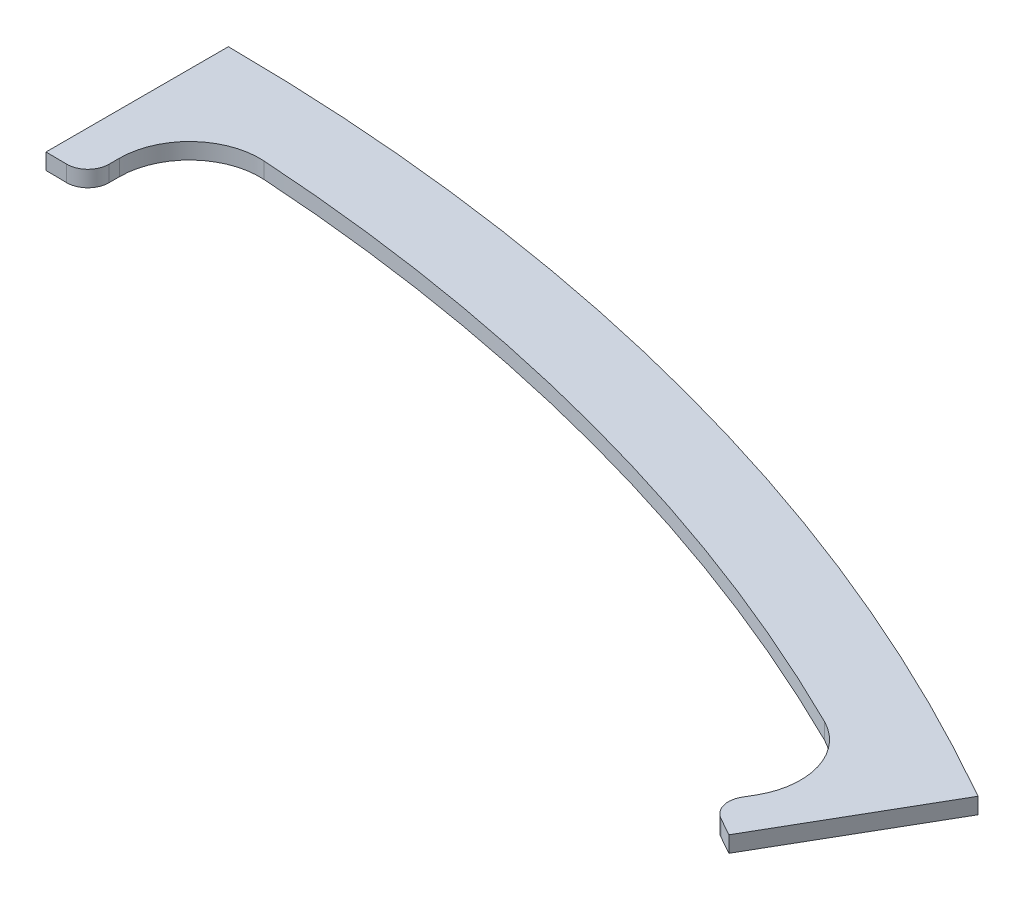
ISO-10303-21;
HEADER;
FILE_DESCRIPTION(('STEP AP214'),'2;1');
FILE_NAME('part.step','',(''),(''),'','','');
FILE_SCHEMA(('AUTOMOTIVE_DESIGN { 1 0 10303 214 1 1 1 1 }'));
ENDSEC;
DATA;
#1=APPLICATION_CONTEXT('core data for automotive mechanical design processes');
#2=APPLICATION_PROTOCOL_DEFINITION('international standard','automotive_design',2000,#1);
#3=PRODUCT_CONTEXT('',#1,'mechanical');
#4=PRODUCT('Part','Part','',(#3));
#5=PRODUCT_RELATED_PRODUCT_CATEGORY('part','',(#4));
#6=PRODUCT_DEFINITION_FORMATION('','',#4);
#7=PRODUCT_DEFINITION_CONTEXT('part definition',#1,'design');
#8=PRODUCT_DEFINITION('design','',#6,#7);
#9=PRODUCT_DEFINITION_SHAPE('','',#8);
#10=(LENGTH_UNIT() NAMED_UNIT(*) SI_UNIT(.MILLI.,.METRE.));
#11=(NAMED_UNIT(*) PLANE_ANGLE_UNIT() SI_UNIT($,.RADIAN.));
#12=(NAMED_UNIT(*) SI_UNIT($,.STERADIAN.) SOLID_ANGLE_UNIT());
#13=UNCERTAINTY_MEASURE_WITH_UNIT(LENGTH_MEASURE(1.E-05),#10,'distance_accuracy_value','');
#14=(GEOMETRIC_REPRESENTATION_CONTEXT(3) GLOBAL_UNCERTAINTY_ASSIGNED_CONTEXT((#13)) GLOBAL_UNIT_ASSIGNED_CONTEXT((#10,
#11,#12)) REPRESENTATION_CONTEXT('',''));
#15=CARTESIAN_POINT('',(0.,0.,0.));
#16=DIRECTION('',(0.,0.,1.));
#17=DIRECTION('',(1.,0.,0.));
#18=AXIS2_PLACEMENT_3D('',#15,#16,#17);
#19=CARTESIAN_POINT('',(0.,2.29,0.));
#20=DIRECTION('',(0.,-1.,0.));
#21=DIRECTION('',(0.,0.,-1.));
#22=AXIS2_PLACEMENT_3D('',#19,#20,#21);
#23=CYLINDRICAL_SURFACE('',#22,271.500362135864);
#24=CARTESIAN_POINT('',(0.,0.,0.));
#25=DIRECTION('',(0.,-1.,0.));
#26=DIRECTION('',(0.,0.,-1.));
#27=AXIS2_PLACEMENT_3D('',#24,#25,#26);
#28=CIRCLE('',#27,271.500362135864);
#29=CARTESIAN_POINT('',(1.50000000000001,0.,-271.496218463361));
#30=VERTEX_POINT('',#29);
#31=CARTESIAN_POINT('',(4.45081973701253,0.,-271.463877603584));
#32=VERTEX_POINT('',#31);
#33=EDGE_CURVE('E230',#30,#32,#28,.T.);
#34=ORIENTED_EDGE('',*,*,#33,.T.);
#35=DIRECTION('',(0.,-1.,0.));
#36=VECTOR('',#35,1.);
#37=CARTESIAN_POINT('',(4.45081973701253,2.29,-271.463877603584));
#38=LINE('',#37,#36);
#39=CARTESIAN_POINT('',(4.45081973701253,2.29,-271.463877603584));
#40=VERTEX_POINT('',#39);
#41=EDGE_CURVE('E52',#32,#40,#38,.F.);
#42=ORIENTED_EDGE('',*,*,#41,.T.);
#43=CARTESIAN_POINT('',(0.,2.29,0.));
#44=DIRECTION('',(0.,-1.,0.));
#45=DIRECTION('',(0.,0.,-1.));
#46=AXIS2_PLACEMENT_3D('',#43,#44,#45);
#47=CIRCLE('',#46,271.500362135864);
#48=CARTESIAN_POINT('',(1.50000000000001,2.29,-271.496218463361));
#49=VERTEX_POINT('',#48);
#50=EDGE_CURVE('E229',#49,#40,#47,.T.);
#51=ORIENTED_EDGE('',*,*,#50,.F.);
#52=DIRECTION('',(0.,-1.,0.));
#53=VECTOR('',#52,1.);
#54=CARTESIAN_POINT('',(1.50000000000001,2.29,-271.496218463361));
#55=LINE('',#54,#53);
#56=EDGE_CURVE('E140',#49,#30,#55,.T.);
#57=ORIENTED_EDGE('',*,*,#56,.T.);
#58=EDGE_LOOP('',(#34,#42,#51,#57));
#59=FACE_BOUND('',#58,.T.);
#60=ADVANCED_FACE('F43',(#59),#23,.F.);
#61=CARTESIAN_POINT('',(0.,2.29,0.));
#62=DIRECTION('',(0.,-1.,0.));
#63=DIRECTION('',(0.,0.,-1.));
#64=AXIS2_PLACEMENT_3D('',#61,#62,#63);
#65=CYLINDRICAL_SURFACE('',#64,297.5);
#66=CARTESIAN_POINT('',(0.,0.,0.));
#67=DIRECTION('',(0.,1.,0.));
#68=DIRECTION('',(0.,0.,-1.));
#69=AXIS2_PLACEMENT_3D('',#66,#67,#68);
#70=CIRCLE('',#69,297.5);
#71=CARTESIAN_POINT('',(147.449071126004,0.,-258.389282719076));
#72=VERTEX_POINT('',#71);
#73=CARTESIAN_POINT('',(1.50000000000001,0.,-297.496218463361));
#74=VERTEX_POINT('',#73);
#75=EDGE_CURVE('E161',#72,#74,#70,.T.);
#76=ORIENTED_EDGE('',*,*,#75,.T.);
#77=DIRECTION('',(0.,-1.,0.));
#78=VECTOR('',#77,1.);
#79=CARTESIAN_POINT('',(1.50000000000001,2.29,-297.496218463361));
#80=LINE('',#79,#78);
#81=CARTESIAN_POINT('',(1.50000000000001,2.29,-297.496218463361));
#82=VERTEX_POINT('',#81);
#83=EDGE_CURVE('E137',#82,#74,#80,.T.);
#84=ORIENTED_EDGE('',*,*,#83,.F.);
#85=CARTESIAN_POINT('',(0.,2.29,0.));
#86=DIRECTION('',(0.,1.,0.));
#87=DIRECTION('',(0.,0.,-1.));
#88=AXIS2_PLACEMENT_3D('',#85,#86,#87);
#89=CIRCLE('',#88,297.5);
#90=CARTESIAN_POINT('',(147.449071126004,2.29,-258.389282719076));
#91=VERTEX_POINT('',#90);
#92=EDGE_CURVE('E146',#91,#82,#89,.T.);
#93=ORIENTED_EDGE('',*,*,#92,.F.);
#94=DIRECTION('',(0.,-1.,0.));
#95=VECTOR('',#94,1.);
#96=CARTESIAN_POINT('',(147.449071126004,2.29,-258.389282719076));
#97=LINE('',#96,#95);
#98=EDGE_CURVE('E237',#91,#72,#97,.T.);
#99=ORIENTED_EDGE('',*,*,#98,.T.);
#100=EDGE_LOOP('',(#76,#84,#93,#99));
#101=FACE_BOUND('',#100,.T.);
#102=ADVANCED_FACE('F159',(#101),#65,.T.);
#103=CARTESIAN_POINT('',(1.50000000000001,2.29,-297.496218463361));
#104=DIRECTION('',(1.,0.,0.));
#105=DIRECTION('',(0.,0.,-1.));
#106=AXIS2_PLACEMENT_3D('',#103,#104,#105);
#107=PLANE('',#106);
#108=DIRECTION('',(0.,0.,1.));
#109=VECTOR('',#108,1.);
#110=CARTESIAN_POINT('',(1.50000000000001,0.,-297.496218463361));
#111=LINE('',#110,#109);
#112=EDGE_CURVE('E242',#74,#30,#111,.T.);
#113=ORIENTED_EDGE('',*,*,#112,.T.);
#114=ORIENTED_EDGE('',*,*,#56,.F.);
#115=DIRECTION('',(0.,0.,1.));
#116=VECTOR('',#115,1.);
#117=CARTESIAN_POINT('',(1.50000000000001,2.29,-297.496218463361));
#118=LINE('',#117,#116);
#119=EDGE_CURVE('E133',#82,#49,#118,.T.);
#120=ORIENTED_EDGE('',*,*,#119,.F.);
#121=ORIENTED_EDGE('',*,*,#83,.T.);
#122=EDGE_LOOP('',(#113,#114,#120,#121));
#123=FACE_BOUND('',#122,.T.);
#124=ADVANCED_FACE('F135',(#123),#107,.F.);
#125=CARTESIAN_POINT('',(131.877415841874,2.29,-237.32002408304));
#126=VERTEX_POINT('',#125);
#127=CARTESIAN_POINT('',(134.449071126004,2.29,-235.87262222068));
#128=VERTEX_POINT('',#127);
#129=EDGE_CURVE('E145',#126,#128,#47,.T.);
#130=ORIENTED_EDGE('',*,*,#129,.F.);
#131=DIRECTION('',(0.,-1.,0.));
#132=VECTOR('',#131,1.);
#133=CARTESIAN_POINT('',(131.877415841874,2.29,-237.32002408304));
#134=LINE('',#133,#132);
#135=CARTESIAN_POINT('',(131.877415841874,0.,-237.32002408304));
#136=VERTEX_POINT('',#135);
#137=EDGE_CURVE('E218',#126,#136,#134,.T.);
#138=ORIENTED_EDGE('',*,*,#137,.T.);
#139=CARTESIAN_POINT('',(134.449071126004,0.,-235.87262222068));
#140=VERTEX_POINT('',#139);
#141=EDGE_CURVE('E246',#136,#140,#28,.T.);
#142=ORIENTED_EDGE('',*,*,#141,.T.);
#143=DIRECTION('',(0.,-1.,0.));
#144=VECTOR('',#143,1.);
#145=CARTESIAN_POINT('',(134.449071126004,2.29,-235.87262222068));
#146=LINE('',#145,#144);
#147=EDGE_CURVE('E170',#128,#140,#146,.T.);
#148=ORIENTED_EDGE('',*,*,#147,.F.);
#149=EDGE_LOOP('',(#130,#138,#142,#148));
#150=FACE_BOUND('',#149,.T.);
#151=ADVANCED_FACE('F291',(#150),#23,.F.);
#152=CARTESIAN_POINT('',(147.449071126004,2.29,-258.389282719076));
#153=DIRECTION('',(-0.866025403784438,0.,-0.500000000000001));
#154=DIRECTION('',(-0.500000000000001,0.,0.866025403784438));
#155=AXIS2_PLACEMENT_3D('',#152,#153,#154);
#156=PLANE('',#155);
#157=DIRECTION('',(0.500000000000001,0.,-0.866025403784438));
#158=VECTOR('',#157,1.);
#159=CARTESIAN_POINT('',(147.449071126004,0.,-258.389282719076));
#160=LINE('',#159,#158);
#161=EDGE_CURVE('E157',#140,#72,#160,.T.);
#162=ORIENTED_EDGE('',*,*,#161,.T.);
#163=ORIENTED_EDGE('',*,*,#98,.F.);
#164=DIRECTION('',(0.500000000000001,0.,-0.866025403784438));
#165=VECTOR('',#164,1.);
#166=CARTESIAN_POINT('',(147.449071126004,2.29,-258.389282719076));
#167=LINE('',#166,#165);
#168=EDGE_CURVE('E152',#128,#91,#167,.T.);
#169=ORIENTED_EDGE('',*,*,#168,.F.);
#170=ORIENTED_EDGE('',*,*,#147,.T.);
#171=EDGE_LOOP('',(#162,#163,#169,#170));
#172=FACE_BOUND('',#171,.T.);
#173=ADVANCED_FACE('F257',(#172),#156,.F.);
#174=CARTESIAN_POINT('',(0.,2.29,0.));
#175=DIRECTION('',(0.,-1.,0.));
#176=DIRECTION('',(0.,0.,-1.));
#177=AXIS2_PLACEMENT_3D('',#174,#175,#176);
#178=PLANE('',#177);
#179=DIRECTION('',(0.5,0.,-0.866025403784438));
#180=VECTOR('',#179,1.);
#181=CARTESIAN_POINT('',(129.203185143459,2.29,-238.786481168198));
#182=LINE('',#181,#180);
#183=CARTESIAN_POINT('',(130.736546701677,2.29,-241.442341293404));
#184=VERTEX_POINT('',#183);
#185=CARTESIAN_POINT('',(131.477814314289,2.29,-242.726254460454));
#186=VERTEX_POINT('',#185);
#187=EDGE_CURVE('E271',#184,#186,#182,.T.);
#188=ORIENTED_EDGE('',*,*,#187,.F.);
#189=CARTESIAN_POINT('',(133.33462291303,2.29,-239.942341293404));
#190=DIRECTION('',(0.,-1.,0.));
#191=DIRECTION('',(0.,0.,-1.));
#192=AXIS2_PLACEMENT_3D('',#189,#190,#191);
#193=CIRCLE('',#192,3.);
#194=EDGE_CURVE('E215',#184,#126,#193,.F.);
#195=ORIENTED_EDGE('',*,*,#194,.T.);
#196=ORIENTED_EDGE('',*,*,#129,.T.);
#197=ORIENTED_EDGE('',*,*,#168,.T.);
#198=ORIENTED_EDGE('',*,*,#92,.T.);
#199=ORIENTED_EDGE('',*,*,#119,.T.);
#200=ORIENTED_EDGE('',*,*,#50,.T.);
#201=CARTESIAN_POINT('',(4.50000000000001,2.29,-274.463474460119));
#202=DIRECTION('',(0.,-1.,0.));
#203=DIRECTION('',(0.,0.,-1.));
#204=AXIS2_PLACEMENT_3D('',#201,#202,#203);
#205=CIRCLE('',#204,3.);
#206=CARTESIAN_POINT('',(7.50000000000001,2.29,-274.463474460119));
#207=VERTEX_POINT('',#206);
#208=EDGE_CURVE('E212',#40,#207,#205,.F.);
#209=ORIENTED_EDGE('',*,*,#208,.T.);
#210=DIRECTION('',(0.,0.,1.));
#211=VECTOR('',#210,1.);
#212=CARTESIAN_POINT('',(7.50000000000001,2.29,-286.402177896714));
#213=LINE('',#212,#211);
#214=CARTESIAN_POINT('',(7.50000000000001,2.29,-275.946009685344));
#215=VERTEX_POINT('',#214);
#216=EDGE_CURVE('E275',#215,#207,#213,.T.);
#217=ORIENTED_EDGE('',*,*,#216,.F.);
#218=CARTESIAN_POINT('',(17.5,2.29,-275.946009685344));
#219=DIRECTION('',(0.,-1.,0.));
#220=DIRECTION('',(0.,0.,-1.));
#221=AXIS2_PLACEMENT_3D('',#218,#219,#220);
#222=CIRCLE('',#221,10.);
#223=CARTESIAN_POINT('',(18.1329105634734,2.29,-285.925960798383));
#224=VERTEX_POINT('',#223);
#225=EDGE_CURVE('E194',#215,#224,#222,.T.);
#226=ORIENTED_EDGE('',*,*,#225,.T.);
#227=CARTESIAN_POINT('',(0.,2.29,0.));
#228=DIRECTION('',(0.,1.,0.));
#229=DIRECTION('',(0.,0.,1.));
#230=AXIS2_PLACEMENT_3D('',#227,#228,#229);
#231=CIRCLE('',#230,286.500362135864);
#232=CARTESIAN_POINT('',(127.259419206672,2.29,-256.685600934609));
#233=VERTEX_POINT('',#232);
#234=EDGE_CURVE('E243',#233,#224,#231,.T.);
#235=ORIENTED_EDGE('',*,*,#234,.F.);
#236=CARTESIAN_POINT('',(122.817560276445,2.29,-247.726254460454));
#237=DIRECTION('',(0.,-1.,0.));
#238=DIRECTION('',(0.,0.,-1.));
#239=AXIS2_PLACEMENT_3D('',#236,#237,#238);
#240=CIRCLE('',#239,10.);
#241=EDGE_CURVE('E201',#233,#186,#240,.T.);
#242=ORIENTED_EDGE('',*,*,#241,.T.);
#243=EDGE_LOOP('',(#188,#195,#196,#197,#198,#199,#200,#209,#217,#226,#235,#242));
#244=FACE_BOUND('',#243,.T.);
#245=ADVANCED_FACE('F150',(#244),#178,.F.);
#246=CARTESIAN_POINT('',(0.,0.,0.));
#247=DIRECTION('',(0.,-1.,0.));
#248=DIRECTION('',(0.,0.,-1.));
#249=AXIS2_PLACEMENT_3D('',#246,#247,#248);
#250=PLANE('',#249);
#251=ORIENTED_EDGE('',*,*,#141,.F.);
#252=CARTESIAN_POINT('',(133.33462291303,0.,-239.942341293404));
#253=DIRECTION('',(0.,-1.,0.));
#254=DIRECTION('',(0.,0.,-1.));
#255=AXIS2_PLACEMENT_3D('',#252,#253,#254);
#256=CIRCLE('',#255,3.);
#257=CARTESIAN_POINT('',(130.736546701677,0.,-241.442341293404));
#258=VERTEX_POINT('',#257);
#259=EDGE_CURVE('E223',#136,#258,#256,.T.);
#260=ORIENTED_EDGE('',*,*,#259,.T.);
#261=DIRECTION('',(-0.5,0.,0.866025403784438));
#262=VECTOR('',#261,1.);
#263=CARTESIAN_POINT('',(-6.49519052838309,0.,-3.74999999999989));
#264=LINE('',#263,#262);
#265=CARTESIAN_POINT('',(131.477814314289,0.,-242.726254460454));
#266=VERTEX_POINT('',#265);
#267=EDGE_CURVE('E163',#266,#258,#264,.T.);
#268=ORIENTED_EDGE('',*,*,#267,.F.);
#269=CARTESIAN_POINT('',(122.817560276445,0.,-247.726254460454));
#270=DIRECTION('',(0.,-1.,0.));
#271=DIRECTION('',(0.,0.,-1.));
#272=AXIS2_PLACEMENT_3D('',#269,#270,#271);
#273=CIRCLE('',#272,10.);
#274=CARTESIAN_POINT('',(127.259419206672,0.,-256.685600934609));
#275=VERTEX_POINT('',#274);
#276=EDGE_CURVE('E205',#266,#275,#273,.F.);
#277=ORIENTED_EDGE('',*,*,#276,.T.);
#278=CARTESIAN_POINT('',(0.,0.,0.));
#279=DIRECTION('',(0.,-1.,0.));
#280=DIRECTION('',(0.,0.,-1.));
#281=AXIS2_PLACEMENT_3D('',#278,#279,#280);
#282=CIRCLE('',#281,286.500362135864);
#283=CARTESIAN_POINT('',(18.1329105634734,0.,-285.925960798383));
#284=VERTEX_POINT('',#283);
#285=EDGE_CURVE('E168',#284,#275,#282,.T.);
#286=ORIENTED_EDGE('',*,*,#285,.F.);
#287=CARTESIAN_POINT('',(17.5,0.,-275.946009685344));
#288=DIRECTION('',(0.,-1.,0.));
#289=DIRECTION('',(0.,0.,-1.));
#290=AXIS2_PLACEMENT_3D('',#287,#288,#289);
#291=CIRCLE('',#290,10.);
#292=CARTESIAN_POINT('',(7.50000000000001,0.,-275.946009685344));
#293=VERTEX_POINT('',#292);
#294=EDGE_CURVE('E197',#284,#293,#291,.F.);
#295=ORIENTED_EDGE('',*,*,#294,.T.);
#296=DIRECTION('',(0.,0.,-1.));
#297=VECTOR('',#296,1.);
#298=CARTESIAN_POINT('',(7.50000000000002,0.,0.));
#299=LINE('',#298,#297);
#300=CARTESIAN_POINT('',(7.50000000000001,0.,-274.463474460119));
#301=VERTEX_POINT('',#300);
#302=EDGE_CURVE('E177',#301,#293,#299,.T.);
#303=ORIENTED_EDGE('',*,*,#302,.F.);
#304=CARTESIAN_POINT('',(4.50000000000001,0.,-274.463474460119));
#305=DIRECTION('',(0.,-1.,0.));
#306=DIRECTION('',(0.,0.,-1.));
#307=AXIS2_PLACEMENT_3D('',#304,#305,#306);
#308=CIRCLE('',#307,3.);
#309=EDGE_CURVE('E59',#301,#32,#308,.T.);
#310=ORIENTED_EDGE('',*,*,#309,.T.);
#311=ORIENTED_EDGE('',*,*,#33,.F.);
#312=ORIENTED_EDGE('',*,*,#112,.F.);
#313=ORIENTED_EDGE('',*,*,#75,.F.);
#314=ORIENTED_EDGE('',*,*,#161,.F.);
#315=EDGE_LOOP('',(#251,#260,#268,#277,#286,#295,#303,#310,#311,#312,#313,#314));
#316=FACE_BOUND('',#315,.T.);
#317=ADVANCED_FACE('F261',(#316),#250,.T.);
#318=CARTESIAN_POINT('',(7.50000000000001,-0.71,-286.402177896714));
#319=DIRECTION('',(-1.,0.,0.));
#320=DIRECTION('',(0.,0.,1.));
#321=AXIS2_PLACEMENT_3D('',#318,#319,#320);
#322=PLANE('',#321);
#323=ORIENTED_EDGE('',*,*,#216,.T.);
#324=DIRECTION('',(0.,-1.,0.));
#325=VECTOR('',#324,1.);
#326=CARTESIAN_POINT('',(7.50000000000001,-0.71,-274.463474460119));
#327=LINE('',#326,#325);
#328=EDGE_CURVE('E11',#207,#301,#327,.T.);
#329=ORIENTED_EDGE('',*,*,#328,.T.);
#330=ORIENTED_EDGE('',*,*,#302,.T.);
#331=DIRECTION('',(0.,-1.,0.));
#332=VECTOR('',#331,1.);
#333=CARTESIAN_POINT('',(7.50000000000001,2.29,-275.946009685344));
#334=LINE('',#333,#332);
#335=EDGE_CURVE('E180',#293,#215,#334,.F.);
#336=ORIENTED_EDGE('',*,*,#335,.T.);
#337=EDGE_LOOP('',(#323,#329,#330,#336));
#338=FACE_BOUND('',#337,.T.);
#339=ADVANCED_FACE('F282',(#338),#322,.F.);
#340=CARTESIAN_POINT('',(0.,-0.71,0.));
#341=DIRECTION('',(0.,1.,0.));
#342=DIRECTION('',(0.,0.,1.));
#343=AXIS2_PLACEMENT_3D('',#340,#341,#342);
#344=CYLINDRICAL_SURFACE('',#343,286.500362135864);
#345=ORIENTED_EDGE('',*,*,#234,.T.);
#346=DIRECTION('',(0.,1.,0.));
#347=VECTOR('',#346,1.);
#348=CARTESIAN_POINT('',(18.1329105634734,-0.71,-285.925960798383));
#349=LINE('',#348,#347);
#350=EDGE_CURVE('E188',#224,#284,#349,.F.);
#351=ORIENTED_EDGE('',*,*,#350,.T.);
#352=ORIENTED_EDGE('',*,*,#285,.T.);
#353=DIRECTION('',(0.,1.,0.));
#354=VECTOR('',#353,1.);
#355=CARTESIAN_POINT('',(127.259419206672,-0.71,-256.685600934609));
#356=LINE('',#355,#354);
#357=EDGE_CURVE('E184',#275,#233,#356,.T.);
#358=ORIENTED_EDGE('',*,*,#357,.T.);
#359=EDGE_LOOP('',(#345,#351,#352,#358));
#360=FACE_BOUND('',#359,.T.);
#361=ADVANCED_FACE('F319',(#360),#344,.F.);
#362=CARTESIAN_POINT('',(129.203185143459,-0.71,-238.786481168198));
#363=DIRECTION('',(0.866025403784438,0.,0.5));
#364=DIRECTION('',(0.5,0.,-0.866025403784438));
#365=AXIS2_PLACEMENT_3D('',#362,#363,#364);
#366=PLANE('',#365);
#367=ORIENTED_EDGE('',*,*,#267,.T.);
#368=DIRECTION('',(0.,-1.,0.));
#369=VECTOR('',#368,1.);
#370=CARTESIAN_POINT('',(130.736546701677,-0.71,-241.442341293404));
#371=LINE('',#370,#369);
#372=EDGE_CURVE('E208',#258,#184,#371,.F.);
#373=ORIENTED_EDGE('',*,*,#372,.T.);
#374=ORIENTED_EDGE('',*,*,#187,.T.);
#375=DIRECTION('',(0.,-1.,0.));
#376=VECTOR('',#375,1.);
#377=CARTESIAN_POINT('',(131.477814314289,0.,-242.726254460454));
#378=LINE('',#377,#376);
#379=EDGE_CURVE('E191',#186,#266,#378,.T.);
#380=ORIENTED_EDGE('',*,*,#379,.T.);
#381=EDGE_LOOP('',(#367,#373,#374,#380));
#382=FACE_BOUND('',#381,.T.);
#383=ADVANCED_FACE('F270',(#382),#366,.F.);
#384=CARTESIAN_POINT('',(17.5,-0.71,-275.946009685344));
#385=DIRECTION('',(0.,1.,0.));
#386=DIRECTION('',(0.,0.,1.));
#387=AXIS2_PLACEMENT_3D('',#384,#385,#386);
#388=CYLINDRICAL_SURFACE('',#387,10.);
#389=ORIENTED_EDGE('',*,*,#294,.F.);
#390=ORIENTED_EDGE('',*,*,#350,.F.);
#391=ORIENTED_EDGE('',*,*,#225,.F.);
#392=ORIENTED_EDGE('',*,*,#335,.F.);
#393=EDGE_LOOP('',(#389,#390,#391,#392));
#394=FACE_BOUND('',#393,.T.);
#395=ADVANCED_FACE('F306',(#394),#388,.F.);
#396=CARTESIAN_POINT('',(122.817560276445,-0.71,-247.726254460454));
#397=DIRECTION('',(0.,1.,0.));
#398=DIRECTION('',(0.,0.,1.));
#399=AXIS2_PLACEMENT_3D('',#396,#397,#398);
#400=CYLINDRICAL_SURFACE('',#399,10.);
#401=ORIENTED_EDGE('',*,*,#276,.F.);
#402=ORIENTED_EDGE('',*,*,#379,.F.);
#403=ORIENTED_EDGE('',*,*,#241,.F.);
#404=ORIENTED_EDGE('',*,*,#357,.F.);
#405=EDGE_LOOP('',(#401,#402,#403,#404));
#406=FACE_BOUND('',#405,.T.);
#407=ADVANCED_FACE('F288',(#406),#400,.F.);
#408=CARTESIAN_POINT('',(133.33462291303,2.29,-239.942341293404));
#409=DIRECTION('',(0.,-1.,0.));
#410=DIRECTION('',(0.,0.,-1.));
#411=AXIS2_PLACEMENT_3D('',#408,#409,#410);
#412=CYLINDRICAL_SURFACE('',#411,3.);
#413=ORIENTED_EDGE('',*,*,#259,.F.);
#414=ORIENTED_EDGE('',*,*,#137,.F.);
#415=ORIENTED_EDGE('',*,*,#194,.F.);
#416=ORIENTED_EDGE('',*,*,#372,.F.);
#417=EDGE_LOOP('',(#413,#414,#415,#416));
#418=FACE_BOUND('',#417,.T.);
#419=ADVANCED_FACE('F268',(#418),#412,.T.);
#420=CARTESIAN_POINT('',(4.50000000000001,2.29,-274.463474460119));
#421=DIRECTION('',(0.,-1.,0.));
#422=DIRECTION('',(0.,0.,-1.));
#423=AXIS2_PLACEMENT_3D('',#420,#421,#422);
#424=CYLINDRICAL_SURFACE('',#423,3.);
#425=ORIENTED_EDGE('',*,*,#309,.F.);
#426=ORIENTED_EDGE('',*,*,#328,.F.);
#427=ORIENTED_EDGE('',*,*,#208,.F.);
#428=ORIENTED_EDGE('',*,*,#41,.F.);
#429=EDGE_LOOP('',(#425,#426,#427,#428));
#430=FACE_BOUND('',#429,.T.);
#431=ADVANCED_FACE('F45',(#430),#424,.T.);
#432=CLOSED_SHELL('',(#60,#102,#124,#151,#173,#245,#317,#339,#361,#383,#395,#407,#419,#431));
#433=MANIFOLD_SOLID_BREP('B2',#432);
#434=ADVANCED_BREP_SHAPE_REPRESENTATION('',(#18,#433),#14);
#435=SHAPE_DEFINITION_REPRESENTATION(#9,#434);
ENDSEC;
END-ISO-10303-21;
